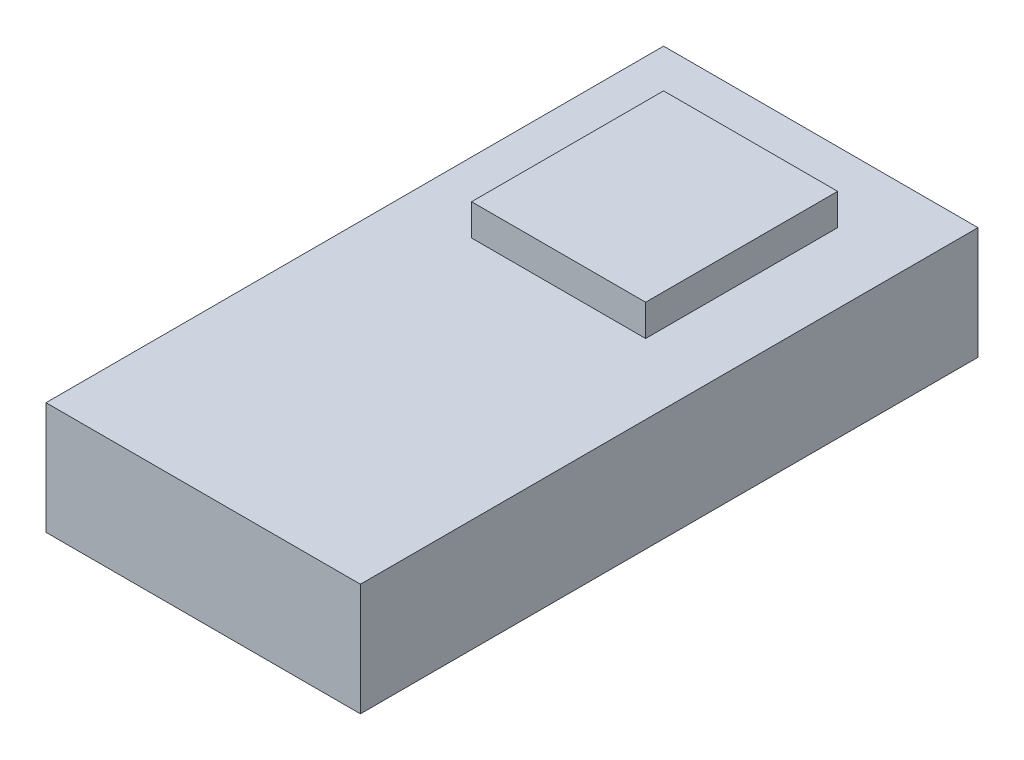
ISO-10303-21;
HEADER;
FILE_DESCRIPTION(('STEP AP214'),'2;1');
FILE_NAME('part.step','',(''),(''),'','','');
FILE_SCHEMA(('AUTOMOTIVE_DESIGN { 1 0 10303 214 1 1 1 1 }'));
ENDSEC;
DATA;
#1=APPLICATION_CONTEXT('core data for automotive mechanical design processes');
#2=APPLICATION_PROTOCOL_DEFINITION('international standard','automotive_design',2000,#1);
#3=PRODUCT_CONTEXT('',#1,'mechanical');
#4=PRODUCT('Part','Part','',(#3));
#5=PRODUCT_RELATED_PRODUCT_CATEGORY('part','',(#4));
#6=PRODUCT_DEFINITION_FORMATION('','',#4);
#7=PRODUCT_DEFINITION_CONTEXT('part definition',#1,'design');
#8=PRODUCT_DEFINITION('design','',#6,#7);
#9=PRODUCT_DEFINITION_SHAPE('','',#8);
#10=(LENGTH_UNIT() NAMED_UNIT(*) SI_UNIT(.MILLI.,.METRE.));
#11=(NAMED_UNIT(*) PLANE_ANGLE_UNIT() SI_UNIT($,.RADIAN.));
#12=(NAMED_UNIT(*) SI_UNIT($,.STERADIAN.) SOLID_ANGLE_UNIT());
#13=UNCERTAINTY_MEASURE_WITH_UNIT(LENGTH_MEASURE(1.E-05),#10,'distance_accuracy_value','');
#14=(GEOMETRIC_REPRESENTATION_CONTEXT(3) GLOBAL_UNCERTAINTY_ASSIGNED_CONTEXT((#13)) GLOBAL_UNIT_ASSIGNED_CONTEXT((#10,
#11,#12)) REPRESENTATION_CONTEXT('',''));
#15=CARTESIAN_POINT('',(0.,0.,0.));
#16=DIRECTION('',(0.,0.,1.));
#17=DIRECTION('',(1.,0.,0.));
#18=AXIS2_PLACEMENT_3D('',#15,#16,#17);
#19=CARTESIAN_POINT('',(0.,10.,0.));
#20=DIRECTION('',(0.,-1.,0.));
#21=DIRECTION('',(0.,0.,-1.));
#22=AXIS2_PLACEMENT_3D('',#19,#20,#21);
#23=PLANE('',#22);
#24=DIRECTION('',(0.,0.,1.));
#25=VECTOR('',#24,1.);
#26=CARTESIAN_POINT('',(0.,10.,0.));
#27=LINE('',#26,#25);
#28=CARTESIAN_POINT('',(0.,10.,-55.));
#29=VERTEX_POINT('',#28);
#30=CARTESIAN_POINT('',(0.,10.,0.));
#31=VERTEX_POINT('',#30);
#32=EDGE_CURVE('E134',#29,#31,#27,.T.);
#33=ORIENTED_EDGE('',*,*,#32,.T.);
#34=DIRECTION('',(1.,0.,0.));
#35=VECTOR('',#34,1.);
#36=CARTESIAN_POINT('',(0.,10.,0.));
#37=LINE('',#36,#35);
#38=CARTESIAN_POINT('',(28.,10.,0.));
#39=VERTEX_POINT('',#38);
#40=EDGE_CURVE('E137',#31,#39,#37,.T.);
#41=ORIENTED_EDGE('',*,*,#40,.T.);
#42=DIRECTION('',(0.,0.,-1.));
#43=VECTOR('',#42,1.);
#44=CARTESIAN_POINT('',(28.,10.,0.));
#45=LINE('',#44,#43);
#46=CARTESIAN_POINT('',(28.,10.,-55.));
#47=VERTEX_POINT('',#46);
#48=EDGE_CURVE('E140',#39,#47,#45,.T.);
#49=ORIENTED_EDGE('',*,*,#48,.T.);
#50=DIRECTION('',(-1.,0.,0.));
#51=VECTOR('',#50,1.);
#52=CARTESIAN_POINT('',(0.,10.,-55.));
#53=LINE('',#52,#51);
#54=EDGE_CURVE('E142',#47,#29,#53,.T.);
#55=ORIENTED_EDGE('',*,*,#54,.T.);
#56=EDGE_LOOP('',(#33,#41,#49,#55));
#57=FACE_BOUND('',#56,.T.);
#58=DIRECTION('',(0.,0.,1.));
#59=VECTOR('',#58,1.);
#60=CARTESIAN_POINT('',(6.25,10.,-48.75));
#61=LINE('',#60,#59);
#62=CARTESIAN_POINT('',(6.25,10.,-48.75));
#63=VERTEX_POINT('',#62);
#64=CARTESIAN_POINT('',(6.25,10.,-31.65));
#65=VERTEX_POINT('',#64);
#66=EDGE_CURVE('E124',#63,#65,#61,.T.);
#67=ORIENTED_EDGE('',*,*,#66,.F.);
#68=DIRECTION('',(-1.,0.,0.));
#69=VECTOR('',#68,1.);
#70=CARTESIAN_POINT('',(6.25,10.,-48.75));
#71=LINE('',#70,#69);
#72=CARTESIAN_POINT('',(21.75,10.,-48.75));
#73=VERTEX_POINT('',#72);
#74=EDGE_CURVE('E121',#73,#63,#71,.T.);
#75=ORIENTED_EDGE('',*,*,#74,.F.);
#76=DIRECTION('',(0.,0.,-1.));
#77=VECTOR('',#76,1.);
#78=CARTESIAN_POINT('',(21.75,10.,-48.75));
#79=LINE('',#78,#77);
#80=CARTESIAN_POINT('',(21.75,10.,-31.65));
#81=VERTEX_POINT('',#80);
#82=EDGE_CURVE('E59',#81,#73,#79,.T.);
#83=ORIENTED_EDGE('',*,*,#82,.F.);
#84=DIRECTION('',(1.,0.,0.));
#85=VECTOR('',#84,1.);
#86=CARTESIAN_POINT('',(6.25,10.,-31.65));
#87=LINE('',#86,#85);
#88=EDGE_CURVE('E54',#65,#81,#87,.T.);
#89=ORIENTED_EDGE('',*,*,#88,.F.);
#90=EDGE_LOOP('',(#67,#75,#83,#89));
#91=FACE_BOUND('',#90,.T.);
#92=ADVANCED_FACE('F39',(#57,#91),#23,.F.);
#93=CARTESIAN_POINT('',(0.,10.,0.));
#94=DIRECTION('',(1.,0.,0.));
#95=DIRECTION('',(0.,0.,-1.));
#96=AXIS2_PLACEMENT_3D('',#93,#94,#95);
#97=PLANE('',#96);
#98=DIRECTION('',(0.,0.,1.));
#99=VECTOR('',#98,1.);
#100=CARTESIAN_POINT('',(0.,0.,0.));
#101=LINE('',#100,#99);
#102=CARTESIAN_POINT('',(0.,0.,-55.));
#103=VERTEX_POINT('',#102);
#104=CARTESIAN_POINT('',(0.,0.,0.));
#105=VERTEX_POINT('',#104);
#106=EDGE_CURVE('E125',#103,#105,#101,.T.);
#107=ORIENTED_EDGE('',*,*,#106,.T.);
#108=DIRECTION('',(0.,-1.,0.));
#109=VECTOR('',#108,1.);
#110=CARTESIAN_POINT('',(0.,10.,0.));
#111=LINE('',#110,#109);
#112=EDGE_CURVE('E11',#31,#105,#111,.T.);
#113=ORIENTED_EDGE('',*,*,#112,.F.);
#114=ORIENTED_EDGE('',*,*,#32,.F.);
#115=DIRECTION('',(0.,-1.,0.));
#116=VECTOR('',#115,1.);
#117=CARTESIAN_POINT('',(0.,10.,-55.));
#118=LINE('',#117,#116);
#119=EDGE_CURVE('E143',#29,#103,#118,.T.);
#120=ORIENTED_EDGE('',*,*,#119,.T.);
#121=EDGE_LOOP('',(#107,#113,#114,#120));
#122=FACE_BOUND('',#121,.T.);
#123=ADVANCED_FACE('F41',(#122),#97,.F.);
#124=CARTESIAN_POINT('',(0.,10.,0.));
#125=DIRECTION('',(0.,0.,-1.));
#126=DIRECTION('',(-1.,0.,0.));
#127=AXIS2_PLACEMENT_3D('',#124,#125,#126);
#128=PLANE('',#127);
#129=DIRECTION('',(1.,0.,0.));
#130=VECTOR('',#129,1.);
#131=CARTESIAN_POINT('',(0.,0.,0.));
#132=LINE('',#131,#130);
#133=CARTESIAN_POINT('',(28.,0.,0.));
#134=VERTEX_POINT('',#133);
#135=EDGE_CURVE('E128',#105,#134,#132,.T.);
#136=ORIENTED_EDGE('',*,*,#135,.T.);
#137=DIRECTION('',(0.,-1.,0.));
#138=VECTOR('',#137,1.);
#139=CARTESIAN_POINT('',(28.,10.,0.));
#140=LINE('',#139,#138);
#141=EDGE_CURVE('E47',#39,#134,#140,.T.);
#142=ORIENTED_EDGE('',*,*,#141,.F.);
#143=ORIENTED_EDGE('',*,*,#40,.F.);
#144=ORIENTED_EDGE('',*,*,#112,.T.);
#145=EDGE_LOOP('',(#136,#142,#143,#144));
#146=FACE_BOUND('',#145,.T.);
#147=ADVANCED_FACE('F173',(#146),#128,.F.);
#148=CARTESIAN_POINT('',(28.,10.,0.));
#149=DIRECTION('',(-1.,0.,0.));
#150=DIRECTION('',(0.,0.,1.));
#151=AXIS2_PLACEMENT_3D('',#148,#149,#150);
#152=PLANE('',#151);
#153=DIRECTION('',(0.,0.,-1.));
#154=VECTOR('',#153,1.);
#155=CARTESIAN_POINT('',(28.,0.,0.));
#156=LINE('',#155,#154);
#157=CARTESIAN_POINT('',(28.,0.,-55.));
#158=VERTEX_POINT('',#157);
#159=EDGE_CURVE('E146',#134,#158,#156,.T.);
#160=ORIENTED_EDGE('',*,*,#159,.T.);
#161=DIRECTION('',(0.,-1.,0.));
#162=VECTOR('',#161,1.);
#163=CARTESIAN_POINT('',(28.,10.,-55.));
#164=LINE('',#163,#162);
#165=EDGE_CURVE('E151',#47,#158,#164,.T.);
#166=ORIENTED_EDGE('',*,*,#165,.F.);
#167=ORIENTED_EDGE('',*,*,#48,.F.);
#168=ORIENTED_EDGE('',*,*,#141,.T.);
#169=EDGE_LOOP('',(#160,#166,#167,#168));
#170=FACE_BOUND('',#169,.T.);
#171=ADVANCED_FACE('F158',(#170),#152,.F.);
#172=CARTESIAN_POINT('',(0.,10.,-55.));
#173=DIRECTION('',(0.,0.,1.));
#174=DIRECTION('',(1.,0.,0.));
#175=AXIS2_PLACEMENT_3D('',#172,#173,#174);
#176=PLANE('',#175);
#177=DIRECTION('',(-1.,0.,0.));
#178=VECTOR('',#177,1.);
#179=CARTESIAN_POINT('',(0.,0.,-55.));
#180=LINE('',#179,#178);
#181=EDGE_CURVE('E138',#158,#103,#180,.T.);
#182=ORIENTED_EDGE('',*,*,#181,.T.);
#183=ORIENTED_EDGE('',*,*,#119,.F.);
#184=ORIENTED_EDGE('',*,*,#54,.F.);
#185=ORIENTED_EDGE('',*,*,#165,.T.);
#186=EDGE_LOOP('',(#182,#183,#184,#185));
#187=FACE_BOUND('',#186,.T.);
#188=ADVANCED_FACE('F167',(#187),#176,.F.);
#189=CARTESIAN_POINT('',(0.,0.,0.));
#190=DIRECTION('',(0.,-1.,0.));
#191=DIRECTION('',(0.,0.,-1.));
#192=AXIS2_PLACEMENT_3D('',#189,#190,#191);
#193=PLANE('',#192);
#194=ORIENTED_EDGE('',*,*,#106,.F.);
#195=ORIENTED_EDGE('',*,*,#181,.F.);
#196=ORIENTED_EDGE('',*,*,#159,.F.);
#197=ORIENTED_EDGE('',*,*,#135,.F.);
#198=EDGE_LOOP('',(#194,#195,#196,#197));
#199=FACE_BOUND('',#198,.T.);
#200=ADVANCED_FACE('F164',(#199),#193,.T.);
#201=CARTESIAN_POINT('',(6.25,12.8,-48.75));
#202=DIRECTION('',(1.,0.,0.));
#203=DIRECTION('',(0.,0.,-1.));
#204=AXIS2_PLACEMENT_3D('',#201,#202,#203);
#205=PLANE('',#204);
#206=ORIENTED_EDGE('',*,*,#66,.T.);
#207=DIRECTION('',(0.,-1.,0.));
#208=VECTOR('',#207,1.);
#209=CARTESIAN_POINT('',(6.25,12.8,-31.65));
#210=LINE('',#209,#208);
#211=CARTESIAN_POINT('',(6.25,12.8,-31.65));
#212=VERTEX_POINT('',#211);
#213=EDGE_CURVE('E105',#212,#65,#210,.T.);
#214=ORIENTED_EDGE('',*,*,#213,.F.);
#215=DIRECTION('',(0.,0.,1.));
#216=VECTOR('',#215,1.);
#217=CARTESIAN_POINT('',(6.25,12.8,-48.75));
#218=LINE('',#217,#216);
#219=CARTESIAN_POINT('',(6.25,12.8,-48.75));
#220=VERTEX_POINT('',#219);
#221=EDGE_CURVE('E112',#220,#212,#218,.T.);
#222=ORIENTED_EDGE('',*,*,#221,.F.);
#223=DIRECTION('',(0.,-1.,0.));
#224=VECTOR('',#223,1.);
#225=CARTESIAN_POINT('',(6.25,12.8,-48.75));
#226=LINE('',#225,#224);
#227=EDGE_CURVE('E251',#220,#63,#226,.T.);
#228=ORIENTED_EDGE('',*,*,#227,.T.);
#229=EDGE_LOOP('',(#206,#214,#222,#228));
#230=FACE_BOUND('',#229,.T.);
#231=ADVANCED_FACE('F123',(#230),#205,.F.);
#232=CARTESIAN_POINT('',(6.25,12.8,-31.65));
#233=DIRECTION('',(0.,0.,-1.));
#234=DIRECTION('',(-1.,0.,0.));
#235=AXIS2_PLACEMENT_3D('',#232,#233,#234);
#236=PLANE('',#235);
#237=ORIENTED_EDGE('',*,*,#88,.T.);
#238=DIRECTION('',(0.,-1.,0.));
#239=VECTOR('',#238,1.);
#240=CARTESIAN_POINT('',(21.75,12.8,-31.65));
#241=LINE('',#240,#239);
#242=CARTESIAN_POINT('',(21.75,12.8,-31.65));
#243=VERTEX_POINT('',#242);
#244=EDGE_CURVE('E108',#243,#81,#241,.T.);
#245=ORIENTED_EDGE('',*,*,#244,.F.);
#246=DIRECTION('',(1.,0.,0.));
#247=VECTOR('',#246,1.);
#248=CARTESIAN_POINT('',(6.25,12.8,-31.65));
#249=LINE('',#248,#247);
#250=EDGE_CURVE('E101',#212,#243,#249,.T.);
#251=ORIENTED_EDGE('',*,*,#250,.F.);
#252=ORIENTED_EDGE('',*,*,#213,.T.);
#253=EDGE_LOOP('',(#237,#245,#251,#252));
#254=FACE_BOUND('',#253,.T.);
#255=ADVANCED_FACE('F103',(#254),#236,.F.);
#256=CARTESIAN_POINT('',(21.75,12.8,-48.75));
#257=DIRECTION('',(-1.,0.,0.));
#258=DIRECTION('',(0.,0.,1.));
#259=AXIS2_PLACEMENT_3D('',#256,#257,#258);
#260=PLANE('',#259);
#261=ORIENTED_EDGE('',*,*,#82,.T.);
#262=DIRECTION('',(0.,-1.,0.));
#263=VECTOR('',#262,1.);
#264=CARTESIAN_POINT('',(21.75,12.8,-48.75));
#265=LINE('',#264,#263);
#266=CARTESIAN_POINT('',(21.75,12.8,-48.75));
#267=VERTEX_POINT('',#266);
#268=EDGE_CURVE('E130',#267,#73,#265,.T.);
#269=ORIENTED_EDGE('',*,*,#268,.F.);
#270=DIRECTION('',(0.,0.,-1.));
#271=VECTOR('',#270,1.);
#272=CARTESIAN_POINT('',(21.75,12.8,-48.75));
#273=LINE('',#272,#271);
#274=EDGE_CURVE('E111',#243,#267,#273,.T.);
#275=ORIENTED_EDGE('',*,*,#274,.F.);
#276=ORIENTED_EDGE('',*,*,#244,.T.);
#277=EDGE_LOOP('',(#261,#269,#275,#276));
#278=FACE_BOUND('',#277,.T.);
#279=ADVANCED_FACE('F220',(#278),#260,.F.);
#280=CARTESIAN_POINT('',(6.25,12.8,-48.75));
#281=DIRECTION('',(0.,0.,1.));
#282=DIRECTION('',(1.,0.,0.));
#283=AXIS2_PLACEMENT_3D('',#280,#281,#282);
#284=PLANE('',#283);
#285=ORIENTED_EDGE('',*,*,#74,.T.);
#286=ORIENTED_EDGE('',*,*,#227,.F.);
#287=DIRECTION('',(-1.,0.,0.));
#288=VECTOR('',#287,1.);
#289=CARTESIAN_POINT('',(6.25,12.8,-48.75));
#290=LINE('',#289,#288);
#291=EDGE_CURVE('E117',#267,#220,#290,.T.);
#292=ORIENTED_EDGE('',*,*,#291,.F.);
#293=ORIENTED_EDGE('',*,*,#268,.T.);
#294=EDGE_LOOP('',(#285,#286,#292,#293));
#295=FACE_BOUND('',#294,.T.);
#296=ADVANCED_FACE('F228',(#295),#284,.F.);
#297=CARTESIAN_POINT('',(0.,12.8,0.));
#298=DIRECTION('',(0.,1.,0.));
#299=DIRECTION('',(0.,0.,1.));
#300=AXIS2_PLACEMENT_3D('',#297,#298,#299);
#301=PLANE('',#300);
#302=ORIENTED_EDGE('',*,*,#221,.T.);
#303=ORIENTED_EDGE('',*,*,#250,.T.);
#304=ORIENTED_EDGE('',*,*,#274,.T.);
#305=ORIENTED_EDGE('',*,*,#291,.T.);
#306=EDGE_LOOP('',(#302,#303,#304,#305));
#307=FACE_BOUND('',#306,.T.);
#308=ADVANCED_FACE('F115',(#307),#301,.T.);
#309=CLOSED_SHELL('',(#92,#123,#147,#171,#188,#200,#231,#255,#279,#296,#308));
#310=MANIFOLD_SOLID_BREP('B2',#309);
#311=ADVANCED_BREP_SHAPE_REPRESENTATION('',(#18,#310),#14);
#312=SHAPE_DEFINITION_REPRESENTATION(#9,#311);
ENDSEC;
END-ISO-10303-21;
